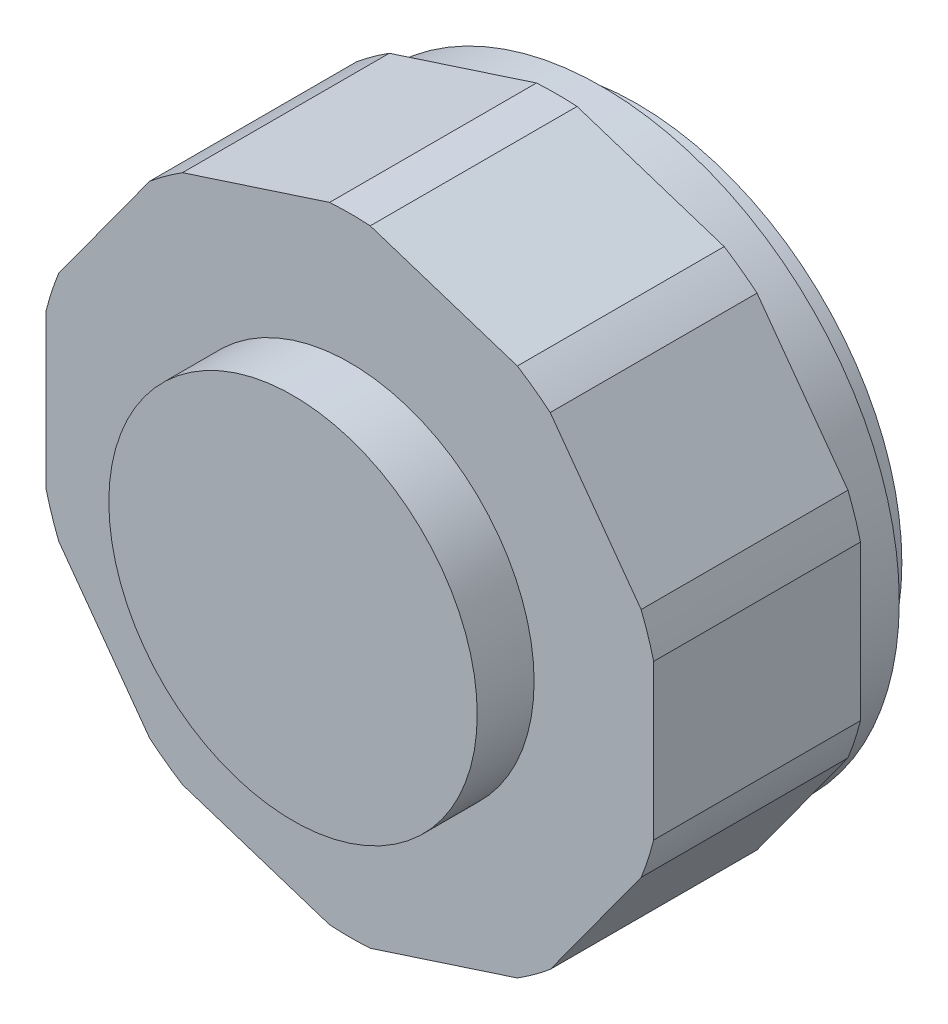
ISO-10303-21;
HEADER;
FILE_DESCRIPTION(('STEP AP214'),'2;1');
FILE_NAME('part.step','',(''),(''),'','','');
FILE_SCHEMA(('AUTOMOTIVE_DESIGN { 1 0 10303 214 1 1 1 1 }'));
ENDSEC;
DATA;
#1=APPLICATION_CONTEXT('core data for automotive mechanical design processes');
#2=APPLICATION_PROTOCOL_DEFINITION('international standard','automotive_design',2000,#1);
#3=PRODUCT_CONTEXT('',#1,'mechanical');
#4=PRODUCT('Part','Part','',(#3));
#5=PRODUCT_RELATED_PRODUCT_CATEGORY('part','',(#4));
#6=PRODUCT_DEFINITION_FORMATION('','',#4);
#7=PRODUCT_DEFINITION_CONTEXT('part definition',#1,'design');
#8=PRODUCT_DEFINITION('design','',#6,#7);
#9=PRODUCT_DEFINITION_SHAPE('','',#8);
#10=(LENGTH_UNIT() NAMED_UNIT(*) SI_UNIT(.MILLI.,.METRE.));
#11=(NAMED_UNIT(*) PLANE_ANGLE_UNIT() SI_UNIT($,.RADIAN.));
#12=(NAMED_UNIT(*) SI_UNIT($,.STERADIAN.) SOLID_ANGLE_UNIT());
#13=UNCERTAINTY_MEASURE_WITH_UNIT(LENGTH_MEASURE(1.E-05),#10,'distance_accuracy_value','');
#14=(GEOMETRIC_REPRESENTATION_CONTEXT(3) GLOBAL_UNCERTAINTY_ASSIGNED_CONTEXT((#13)) GLOBAL_UNIT_ASSIGNED_CONTEXT((#10,
#11,#12)) REPRESENTATION_CONTEXT('',''));
#15=CARTESIAN_POINT('',(0.,0.,0.));
#16=DIRECTION('',(0.,0.,1.));
#17=DIRECTION('',(1.,0.,0.));
#18=AXIS2_PLACEMENT_3D('',#15,#16,#17);
#19=CARTESIAN_POINT('',(-582.,0.,957.757083440668));
#20=DIRECTION('',(0.,0.,-1.));
#21=DIRECTION('',(0.,1.,0.));
#22=AXIS2_PLACEMENT_3D('',#19,#20,#21);
#23=CYLINDRICAL_SURFACE('',#22,205.);
#24=CARTESIAN_POINT('',(-582.,0.,247.));
#25=DIRECTION('',(0.,0.,-1.));
#26=DIRECTION('',(0.,1.,0.));
#27=AXIS2_PLACEMENT_3D('',#24,#25,#26);
#28=CIRCLE('',#27,205.);
#29=CARTESIAN_POINT('',(-582.,205.,247.));
#30=VERTEX_POINT('',#29);
#31=EDGE_CURVE('E167',#30,#30,#28,.T.);
#32=ORIENTED_EDGE('',*,*,#31,.T.);
#33=EDGE_LOOP('',(#32));
#34=FACE_BOUND('',#33,.T.);
#35=CARTESIAN_POINT('',(-582.,0.,220.));
#36=DIRECTION('',(0.,0.,1.));
#37=DIRECTION('',(0.,1.,0.));
#38=AXIS2_PLACEMENT_3D('',#35,#36,#37);
#39=CIRCLE('',#38,205.);
#40=CARTESIAN_POINT('',(-582.,205.,220.));
#41=VERTEX_POINT('',#40);
#42=EDGE_CURVE('E182',#41,#41,#39,.T.);
#43=ORIENTED_EDGE('',*,*,#42,.T.);
#44=EDGE_LOOP('',(#43));
#45=FACE_BOUND('',#44,.T.);
#46=ADVANCED_FACE('F17',(#34,#45),#23,.T.);
#47=CARTESIAN_POINT('',(-582.,0.,247.));
#48=DIRECTION('',(0.,0.,-1.));
#49=DIRECTION('',(0.,1.,0.));
#50=AXIS2_PLACEMENT_3D('',#47,#48,#49);
#51=PLANE('',#50);
#52=ORIENTED_EDGE('',*,*,#31,.F.);
#53=EDGE_LOOP('',(#52));
#54=FACE_BOUND('',#53,.T.);
#55=CARTESIAN_POINT('',(-582.,0.,247.));
#56=DIRECTION('',(0.,0.,-1.));
#57=DIRECTION('',(1.,0.,0.));
#58=AXIS2_PLACEMENT_3D('',#55,#56,#57);
#59=CIRCLE('',#58,230.);
#60=CARTESIAN_POINT('',(-352.,0.,247.));
#61=VERTEX_POINT('',#60);
#62=EDGE_CURVE('E268',#61,#61,#59,.T.);
#63=ORIENTED_EDGE('',*,*,#62,.T.);
#64=EDGE_LOOP('',(#63));
#65=FACE_BOUND('',#64,.T.);
#66=ADVANCED_FACE('F392',(#54,#65),#51,.T.);
#67=CARTESIAN_POINT('',(-582.,0.,247.));
#68=DIRECTION('',(0.,0.,1.));
#69=DIRECTION('',(0.,-1.,0.));
#70=AXIS2_PLACEMENT_3D('',#67,#68,#69);
#71=CYLINDRICAL_SURFACE('',#70,230.);
#72=CARTESIAN_POINT('',(-582.,0.,282.));
#73=DIRECTION('',(0.,0.,-1.));
#74=DIRECTION('',(0.,1.,0.));
#75=AXIS2_PLACEMENT_3D('',#72,#73,#74);
#76=CIRCLE('',#75,230.);
#77=CARTESIAN_POINT('',(-582.,230.,282.));
#78=VERTEX_POINT('',#77);
#79=EDGE_CURVE('E271',#78,#78,#76,.F.);
#80=ORIENTED_EDGE('',*,*,#79,.F.);
#81=EDGE_LOOP('',(#80));
#82=FACE_BOUND('',#81,.T.);
#83=ORIENTED_EDGE('',*,*,#62,.F.);
#84=EDGE_LOOP('',(#83));
#85=FACE_BOUND('',#84,.T.);
#86=ADVANCED_FACE('F398',(#82,#85),#71,.T.);
#87=CARTESIAN_POINT('',(-582.,0.,282.));
#88=DIRECTION('',(0.,0.,-1.));
#89=DIRECTION('',(0.,1.,0.));
#90=AXIS2_PLACEMENT_3D('',#87,#88,#89);
#91=PLANE('',#90);
#92=ORIENTED_EDGE('',*,*,#79,.T.);
#93=EDGE_LOOP('',(#92));
#94=FACE_BOUND('',#93,.T.);
#95=CARTESIAN_POINT('',(-582.,0.,282.));
#96=DIRECTION('',(0.,0.,-1.));
#97=DIRECTION('',(-0.587785252292473,-0.809016994374947,0.));
#98=AXIS2_PLACEMENT_3D('',#95,#96,#97);
#99=CIRCLE('',#98,242.5);
#100=CARTESIAN_POINT('',(-427.056160116112,-186.543980020895,282.));
#101=VERTEX_POINT('',#100);
#102=CARTESIAN_POINT('',(-452.466411923327,-205.005608606162,282.));
#103=VERTEX_POINT('',#102);
#104=EDGE_CURVE('E181',#101,#103,#99,.T.);
#105=ORIENTED_EDGE('',*,*,#104,.T.);
#106=DIRECTION('',(-0.951056516295154,-0.309016994374947,0.));
#107=VECTOR('',#106,1.);
#108=CARTESIAN_POINT('',(-452.466411923327,-205.005608606162,282.));
#109=LINE('',#108,#107);
#110=CARTESIAN_POINT('',(-566.295600720448,-241.990954052561,282.));
#111=VERTEX_POINT('',#110);
#112=EDGE_CURVE('E187',#103,#111,#109,.T.);
#113=ORIENTED_EDGE('',*,*,#112,.T.);
#114=CARTESIAN_POINT('',(-597.704399279552,-241.990954052561,282.));
#115=VERTEX_POINT('',#114);
#116=EDGE_CURVE('E189',#111,#115,#99,.T.);
#117=ORIENTED_EDGE('',*,*,#116,.T.);
#118=DIRECTION('',(-0.951056516295154,0.309016994374946,0.));
#119=VECTOR('',#118,1.);
#120=CARTESIAN_POINT('',(-597.704399279552,-241.990954052561,282.));
#121=LINE('',#120,#119);
#122=CARTESIAN_POINT('',(-711.533588076673,-205.005608606162,282.));
#123=VERTEX_POINT('',#122);
#124=EDGE_CURVE('E195',#115,#123,#121,.T.);
#125=ORIENTED_EDGE('',*,*,#124,.T.);
#126=CARTESIAN_POINT('',(-582.,0.,282.));
#127=DIRECTION('',(0.,0.,-1.));
#128=DIRECTION('',(0.587785252292473,0.809016994374947,0.));
#129=AXIS2_PLACEMENT_3D('',#126,#127,#128);
#130=CIRCLE('',#129,242.5);
#131=CARTESIAN_POINT('',(-736.943839883888,-186.543980020895,282.));
#132=VERTEX_POINT('',#131);
#133=EDGE_CURVE('E200',#123,#132,#130,.T.);
#134=ORIENTED_EDGE('',*,*,#133,.T.);
#135=DIRECTION('',(-0.587785252292474,0.809016994374947,0.));
#136=VECTOR('',#135,1.);
#137=CARTESIAN_POINT('',(-736.943839883888,-186.543980020895,282.));
#138=LINE('',#137,#136);
#139=CARTESIAN_POINT('',(-807.294147472337,-89.7150885565674,282.));
#140=VERTEX_POINT('',#139);
#141=EDGE_CURVE('E204',#132,#140,#138,.T.);
#142=ORIENTED_EDGE('',*,*,#141,.T.);
#143=CARTESIAN_POINT('',(-817.,-59.843546017929,282.));
#144=VERTEX_POINT('',#143);
#145=EDGE_CURVE('E196',#140,#144,#99,.T.);
#146=ORIENTED_EDGE('',*,*,#145,.T.);
#147=DIRECTION('',(0.,1.,0.));
#148=VECTOR('',#147,1.);
#149=CARTESIAN_POINT('',(-817.,-59.8435460179289,282.));
#150=LINE('',#149,#148);
#151=CARTESIAN_POINT('',(-817.,59.843546017929,282.));
#152=VERTEX_POINT('',#151);
#153=EDGE_CURVE('E203',#144,#152,#150,.T.);
#154=ORIENTED_EDGE('',*,*,#153,.T.);
#155=CARTESIAN_POINT('',(-807.294147472337,89.7150885565677,282.));
#156=VERTEX_POINT('',#155);
#157=EDGE_CURVE('E205',#152,#156,#99,.T.);
#158=ORIENTED_EDGE('',*,*,#157,.T.);
#159=DIRECTION('',(0.587785252292473,0.809016994374948,0.));
#160=VECTOR('',#159,1.);
#161=CARTESIAN_POINT('',(-807.294147472337,89.7150885565674,282.));
#162=LINE('',#161,#160);
#163=CARTESIAN_POINT('',(-736.943839883888,186.543980020895,282.));
#164=VERTEX_POINT('',#163);
#165=EDGE_CURVE('E213',#156,#164,#162,.T.);
#166=ORIENTED_EDGE('',*,*,#165,.T.);
#167=CARTESIAN_POINT('',(-711.533588076673,205.005608606162,282.));
#168=VERTEX_POINT('',#167);
#169=EDGE_CURVE('E214',#164,#168,#99,.T.);
#170=ORIENTED_EDGE('',*,*,#169,.T.);
#171=DIRECTION('',(0.951056516295153,0.309016994374948,0.));
#172=VECTOR('',#171,1.);
#173=CARTESIAN_POINT('',(-711.533588076673,205.005608606162,282.));
#174=LINE('',#173,#172);
#175=CARTESIAN_POINT('',(-597.704399279553,241.990954052561,282.));
#176=VERTEX_POINT('',#175);
#177=EDGE_CURVE('E220',#168,#176,#174,.T.);
#178=ORIENTED_EDGE('',*,*,#177,.T.);
#179=CARTESIAN_POINT('',(-566.295600720447,241.990954052561,282.));
#180=VERTEX_POINT('',#179);
#181=EDGE_CURVE('E221',#176,#180,#99,.T.);
#182=ORIENTED_EDGE('',*,*,#181,.T.);
#183=DIRECTION('',(0.951056516295154,-0.309016994374947,0.));
#184=VECTOR('',#183,1.);
#185=CARTESIAN_POINT('',(-566.295600720448,241.990954052561,282.));
#186=LINE('',#185,#184);
#187=CARTESIAN_POINT('',(-452.466411923327,205.005608606162,282.));
#188=VERTEX_POINT('',#187);
#189=EDGE_CURVE('E227',#180,#188,#186,.T.);
#190=ORIENTED_EDGE('',*,*,#189,.T.);
#191=CARTESIAN_POINT('',(-427.056160116112,186.543980020895,282.));
#192=VERTEX_POINT('',#191);
#193=EDGE_CURVE('E186',#188,#192,#99,.T.);
#194=ORIENTED_EDGE('',*,*,#193,.T.);
#195=DIRECTION('',(0.587785252292474,-0.809016994374947,0.));
#196=VECTOR('',#195,1.);
#197=CARTESIAN_POINT('',(-427.056160116112,186.543980020895,282.));
#198=LINE('',#197,#196);
#199=CARTESIAN_POINT('',(-356.705852527663,89.7150885565675,282.));
#200=VERTEX_POINT('',#199);
#201=EDGE_CURVE('E185',#192,#200,#198,.T.);
#202=ORIENTED_EDGE('',*,*,#201,.T.);
#203=CARTESIAN_POINT('',(-347.,59.8435460179294,282.));
#204=VERTEX_POINT('',#203);
#205=EDGE_CURVE('E176',#200,#204,#99,.T.);
#206=ORIENTED_EDGE('',*,*,#205,.T.);
#207=DIRECTION('',(0.,-1.,0.));
#208=VECTOR('',#207,1.);
#209=CARTESIAN_POINT('',(-347.,59.8435460179291,282.));
#210=LINE('',#209,#208);
#211=CARTESIAN_POINT('',(-347.,-59.843546017929,282.));
#212=VERTEX_POINT('',#211);
#213=EDGE_CURVE('E161',#204,#212,#210,.T.);
#214=ORIENTED_EDGE('',*,*,#213,.T.);
#215=CARTESIAN_POINT('',(-356.705852527663,-89.7150885565673,282.));
#216=VERTEX_POINT('',#215);
#217=EDGE_CURVE('E173',#212,#216,#99,.T.);
#218=ORIENTED_EDGE('',*,*,#217,.T.);
#219=DIRECTION('',(-0.587785252292473,-0.809016994374948,0.));
#220=VECTOR('',#219,1.);
#221=CARTESIAN_POINT('',(-356.705852527663,-89.7150885565676,282.));
#222=LINE('',#221,#220);
#223=EDGE_CURVE('E179',#216,#101,#222,.T.);
#224=ORIENTED_EDGE('',*,*,#223,.T.);
#225=EDGE_LOOP('',(#105,#113,#117,#125,#134,#142,#146,#154,#158,#166,#170,#178,#182,#190,#194,
#202,#206,#214,#218,#224));
#226=FACE_BOUND('',#225,.T.);
#227=ADVANCED_FACE('F172',(#94,#226),#91,.T.);
#228=CARTESIAN_POINT('',(-1918.04600991423,770.513838716696,220.));
#229=DIRECTION('',(0.,0.,1.));
#230=DIRECTION('',(0.,-1.,0.));
#231=AXIS2_PLACEMENT_3D('',#228,#229,#230);
#232=PLANE('',#231);
#233=ORIENTED_EDGE('',*,*,#42,.F.);
#234=EDGE_LOOP('',(#233));
#235=FACE_BOUND('',#234,.T.);
#236=ADVANCED_FACE('F410',(#235),#232,.F.);
#237=CARTESIAN_POINT('',(-582.,0.,282.));
#238=DIRECTION('',(0.,0.,1.));
#239=DIRECTION('',(0.,-1.,0.));
#240=AXIS2_PLACEMENT_3D('',#237,#238,#239);
#241=CYLINDRICAL_SURFACE('',#240,242.5);
#242=DIRECTION('',(0.,0.,1.));
#243=VECTOR('',#242,1.);
#244=CARTESIAN_POINT('',(-347.,59.843546017929,282.));
#245=LINE('',#244,#243);
#246=CARTESIAN_POINT('',(-347.,59.8435460179294,442.));
#247=VERTEX_POINT('',#246);
#248=EDGE_CURVE('E26',#247,#204,#245,.F.);
#249=ORIENTED_EDGE('',*,*,#248,.T.);
#250=ORIENTED_EDGE('',*,*,#205,.F.);
#251=DIRECTION('',(0.,0.,1.));
#252=VECTOR('',#251,1.);
#253=CARTESIAN_POINT('',(-356.705852527663,89.7150885565674,282.));
#254=LINE('',#253,#252);
#255=CARTESIAN_POINT('',(-356.705852527663,89.7150885565675,442.));
#256=VERTEX_POINT('',#255);
#257=EDGE_CURVE('E280',#256,#200,#254,.F.);
#258=ORIENTED_EDGE('',*,*,#257,.F.);
#259=CARTESIAN_POINT('',(-582.,0.,442.));
#260=DIRECTION('',(0.,0.,-1.));
#261=DIRECTION('',(-0.587785252292473,-0.809016994374947,0.));
#262=AXIS2_PLACEMENT_3D('',#259,#260,#261);
#263=CIRCLE('',#262,242.5);
#264=EDGE_CURVE('E279',#256,#247,#263,.T.);
#265=ORIENTED_EDGE('',*,*,#264,.T.);
#266=EDGE_LOOP('',(#249,#250,#258,#265));
#267=FACE_BOUND('',#266,.T.);
#268=ADVANCED_FACE('F19',(#267),#241,.T.);
#269=DIRECTION('',(0.,0.,1.));
#270=VECTOR('',#269,1.);
#271=CARTESIAN_POINT('',(-356.705852527663,-89.7150885565675,282.));
#272=LINE('',#271,#270);
#273=CARTESIAN_POINT('',(-356.705852527663,-89.7150885565673,442.));
#274=VERTEX_POINT('',#273);
#275=EDGE_CURVE('E96',#274,#216,#272,.F.);
#276=ORIENTED_EDGE('',*,*,#275,.T.);
#277=ORIENTED_EDGE('',*,*,#217,.F.);
#278=DIRECTION('',(0.,0.,1.));
#279=VECTOR('',#278,1.);
#280=CARTESIAN_POINT('',(-347.,-59.843546017929,282.));
#281=LINE('',#280,#279);
#282=CARTESIAN_POINT('',(-347.,-59.843546017929,442.));
#283=VERTEX_POINT('',#282);
#284=EDGE_CURVE('E158',#283,#212,#281,.F.);
#285=ORIENTED_EDGE('',*,*,#284,.F.);
#286=EDGE_CURVE('E192',#283,#274,#263,.T.);
#287=ORIENTED_EDGE('',*,*,#286,.T.);
#288=EDGE_LOOP('',(#276,#277,#285,#287));
#289=FACE_BOUND('',#288,.T.);
#290=ADVANCED_FACE('F178',(#289),#241,.T.);
#291=CARTESIAN_POINT('',(-347.,-54.6717477313467,1113.75708344067));
#292=DIRECTION('',(-1.,0.,0.));
#293=DIRECTION('',(0.,1.,0.));
#294=AXIS2_PLACEMENT_3D('',#291,#292,#293);
#295=PLANE('',#294);
#296=ORIENTED_EDGE('',*,*,#248,.F.);
#297=DIRECTION('',(0.,-1.,0.));
#298=VECTOR('',#297,1.);
#299=CARTESIAN_POINT('',(-347.,59.8435460179291,442.));
#300=LINE('',#299,#298);
#301=EDGE_CURVE('E163',#247,#283,#300,.T.);
#302=ORIENTED_EDGE('',*,*,#301,.T.);
#303=ORIENTED_EDGE('',*,*,#284,.T.);
#304=ORIENTED_EDGE('',*,*,#213,.F.);
#305=EDGE_LOOP('',(#296,#302,#303,#304));
#306=FACE_BOUND('',#305,.T.);
#307=ADVANCED_FACE('F160',(#306),#295,.F.);
#308=CARTESIAN_POINT('',(-561.376928259029,-240.392780490527,1108.84168369942));
#309=DIRECTION('',(-0.309016994374948,0.951056516295154,0.));
#310=DIRECTION('',(0.951056516295154,0.309016994374948,0.));
#311=AXIS2_PLACEMENT_3D('',#308,#309,#310);
#312=PLANE('',#311);
#313=DIRECTION('',(0.,0.,1.));
#314=VECTOR('',#313,1.);
#315=CARTESIAN_POINT('',(-452.466411923327,-205.005608606162,282.));
#316=LINE('',#315,#314);
#317=CARTESIAN_POINT('',(-452.466411923327,-205.005608606162,442.));
#318=VERTEX_POINT('',#317);
#319=EDGE_CURVE('E105',#318,#103,#316,.F.);
#320=ORIENTED_EDGE('',*,*,#319,.F.);
#321=DIRECTION('',(-0.951056516295154,-0.309016994374947,0.));
#322=VECTOR('',#321,1.);
#323=CARTESIAN_POINT('',(-452.466411923327,-205.005608606162,442.));
#324=LINE('',#323,#322);
#325=CARTESIAN_POINT('',(-566.295600720448,-241.990954052561,442.));
#326=VERTEX_POINT('',#325);
#327=EDGE_CURVE('E296',#318,#326,#324,.T.);
#328=ORIENTED_EDGE('',*,*,#327,.T.);
#329=DIRECTION('',(0.,0.,1.));
#330=VECTOR('',#329,1.);
#331=CARTESIAN_POINT('',(-566.295600720448,-241.990954052561,282.));
#332=LINE('',#331,#330);
#333=EDGE_CURVE('E263',#326,#111,#332,.F.);
#334=ORIENTED_EDGE('',*,*,#333,.T.);
#335=ORIENTED_EDGE('',*,*,#112,.F.);
#336=EDGE_LOOP('',(#320,#328,#334,#335));
#337=FACE_BOUND('',#336,.T.);
#338=ADVANCED_FACE('F380',(#337),#312,.F.);
#339=DIRECTION('',(0.,0.,1.));
#340=VECTOR('',#339,1.);
#341=CARTESIAN_POINT('',(-597.704399279552,-241.990954052561,282.));
#342=LINE('',#341,#340);
#343=CARTESIAN_POINT('',(-597.704399279552,-241.990954052561,442.));
#344=VERTEX_POINT('',#343);
#345=EDGE_CURVE('E261',#344,#115,#342,.F.);
#346=ORIENTED_EDGE('',*,*,#345,.T.);
#347=ORIENTED_EDGE('',*,*,#116,.F.);
#348=ORIENTED_EDGE('',*,*,#333,.F.);
#349=EDGE_CURVE('E297',#326,#344,#263,.T.);
#350=ORIENTED_EDGE('',*,*,#349,.T.);
#351=EDGE_LOOP('',(#346,#347,#348,#350));
#352=FACE_BOUND('',#351,.T.);
#353=ADVANCED_FACE('F379',(#352),#241,.T.);
#354=ORIENTED_EDGE('',*,*,#319,.T.);
#355=ORIENTED_EDGE('',*,*,#104,.F.);
#356=DIRECTION('',(0.,0.,1.));
#357=VECTOR('',#356,1.);
#358=CARTESIAN_POINT('',(-427.056160116112,-186.543980020895,282.));
#359=LINE('',#358,#357);
#360=CARTESIAN_POINT('',(-427.056160116112,-186.543980020895,442.));
#361=VERTEX_POINT('',#360);
#362=EDGE_CURVE('E34',#361,#101,#359,.F.);
#363=ORIENTED_EDGE('',*,*,#362,.F.);
#364=EDGE_CURVE('E292',#361,#318,#263,.T.);
#365=ORIENTED_EDGE('',*,*,#364,.T.);
#366=EDGE_LOOP('',(#354,#355,#363,#365));
#367=FACE_BOUND('',#366,.T.);
#368=ADVANCED_FACE('F381',(#367),#241,.T.);
#369=CARTESIAN_POINT('',(-424.016253355428,-182.35990731557,1108.84168369942));
#370=DIRECTION('',(-0.809016994374947,0.587785252292473,0.));
#371=DIRECTION('',(0.587785252292473,0.809016994374948,0.));
#372=AXIS2_PLACEMENT_3D('',#369,#370,#371);
#373=PLANE('',#372);
#374=ORIENTED_EDGE('',*,*,#362,.T.);
#375=ORIENTED_EDGE('',*,*,#223,.F.);
#376=ORIENTED_EDGE('',*,*,#275,.F.);
#377=DIRECTION('',(-0.587785252292473,-0.809016994374948,0.));
#378=VECTOR('',#377,1.);
#379=CARTESIAN_POINT('',(-356.705852527663,-89.7150885565676,442.));
#380=LINE('',#379,#378);
#381=EDGE_CURVE('E188',#274,#361,#380,.T.);
#382=ORIENTED_EDGE('',*,*,#381,.T.);
#383=EDGE_LOOP('',(#374,#375,#376,#382));
#384=FACE_BOUND('',#383,.T.);
#385=ADVANCED_FACE('F383',(#384),#373,.F.);
#386=CARTESIAN_POINT('',(-804.254240711652,-93.8991612618916,1108.84168369942));
#387=DIRECTION('',(0.809016994374947,0.587785252292473,0.));
#388=DIRECTION('',(0.587785252292473,-0.809016994374947,0.));
#389=AXIS2_PLACEMENT_3D('',#386,#387,#388);
#390=PLANE('',#389);
#391=DIRECTION('',(0.,0.,1.));
#392=VECTOR('',#391,1.);
#393=CARTESIAN_POINT('',(-736.943839883888,-186.543980020895,282.));
#394=LINE('',#393,#392);
#395=CARTESIAN_POINT('',(-736.943839883888,-186.543980020895,442.));
#396=VERTEX_POINT('',#395);
#397=EDGE_CURVE('E244',#396,#132,#394,.F.);
#398=ORIENTED_EDGE('',*,*,#397,.F.);
#399=DIRECTION('',(-0.587785252292474,0.809016994374947,0.));
#400=VECTOR('',#399,1.);
#401=CARTESIAN_POINT('',(-736.943839883888,-186.543980020895,442.));
#402=LINE('',#401,#400);
#403=CARTESIAN_POINT('',(-807.294147472337,-89.7150885565674,442.));
#404=VERTEX_POINT('',#403);
#405=EDGE_CURVE('E248',#396,#404,#402,.T.);
#406=ORIENTED_EDGE('',*,*,#405,.T.);
#407=DIRECTION('',(0.,0.,1.));
#408=VECTOR('',#407,1.);
#409=CARTESIAN_POINT('',(-807.294147472337,-89.7150885565674,282.));
#410=LINE('',#409,#408);
#411=EDGE_CURVE('E246',#404,#140,#410,.F.);
#412=ORIENTED_EDGE('',*,*,#411,.T.);
#413=ORIENTED_EDGE('',*,*,#141,.F.);
#414=EDGE_LOOP('',(#398,#406,#412,#413));
#415=FACE_BOUND('',#414,.T.);
#416=ADVANCED_FACE('F242',(#415),#390,.F.);
#417=DIRECTION('',(0.,0.,1.));
#418=VECTOR('',#417,1.);
#419=CARTESIAN_POINT('',(-817.,-59.8435460179289,282.));
#420=LINE('',#419,#418);
#421=CARTESIAN_POINT('',(-817.,-59.843546017929,442.));
#422=VERTEX_POINT('',#421);
#423=EDGE_CURVE('E252',#422,#144,#420,.F.);
#424=ORIENTED_EDGE('',*,*,#423,.T.);
#425=ORIENTED_EDGE('',*,*,#145,.F.);
#426=ORIENTED_EDGE('',*,*,#411,.F.);
#427=EDGE_CURVE('E360',#404,#422,#263,.T.);
#428=ORIENTED_EDGE('',*,*,#427,.T.);
#429=EDGE_LOOP('',(#424,#425,#426,#428));
#430=FACE_BOUND('',#429,.T.);
#431=ADVANCED_FACE('F445',(#430),#241,.T.);
#432=ORIENTED_EDGE('',*,*,#397,.T.);
#433=ORIENTED_EDGE('',*,*,#133,.F.);
#434=DIRECTION('',(0.,0.,1.));
#435=VECTOR('',#434,1.);
#436=CARTESIAN_POINT('',(-711.533588076673,-205.005608606162,282.));
#437=LINE('',#436,#435);
#438=CARTESIAN_POINT('',(-711.533588076673,-205.005608606162,442.));
#439=VERTEX_POINT('',#438);
#440=EDGE_CURVE('E254',#439,#123,#437,.F.);
#441=ORIENTED_EDGE('',*,*,#440,.F.);
#442=CARTESIAN_POINT('',(-582.,0.,442.));
#443=DIRECTION('',(0.,0.,-1.));
#444=DIRECTION('',(0.587785252292473,0.809016994374947,0.));
#445=AXIS2_PLACEMENT_3D('',#442,#443,#444);
#446=CIRCLE('',#445,242.5);
#447=EDGE_CURVE('E362',#439,#396,#446,.T.);
#448=ORIENTED_EDGE('',*,*,#447,.T.);
#449=EDGE_LOOP('',(#432,#433,#441,#448));
#450=FACE_BOUND('',#449,.T.);
#451=ADVANCED_FACE('F376',(#450),#241,.T.);
#452=CARTESIAN_POINT('',(-706.614915615255,-206.603782168195,1108.84168369942));
#453=DIRECTION('',(0.309016994374948,0.951056516295153,0.));
#454=DIRECTION('',(0.951056516295154,-0.309016994374948,0.));
#455=AXIS2_PLACEMENT_3D('',#452,#453,#454);
#456=PLANE('',#455);
#457=ORIENTED_EDGE('',*,*,#440,.T.);
#458=ORIENTED_EDGE('',*,*,#124,.F.);
#459=ORIENTED_EDGE('',*,*,#345,.F.);
#460=DIRECTION('',(-0.951056516295154,0.309016994374946,0.));
#461=VECTOR('',#460,1.);
#462=CARTESIAN_POINT('',(-597.704399279552,-241.990954052561,442.));
#463=LINE('',#462,#461);
#464=EDGE_CURVE('E365',#344,#439,#463,.T.);
#465=ORIENTED_EDGE('',*,*,#464,.T.);
#466=EDGE_LOOP('',(#457,#458,#459,#465));
#467=FACE_BOUND('',#466,.T.);
#468=ADVANCED_FACE('F378',(#467),#456,.F.);
#469=CARTESIAN_POINT('',(-739.983746644572,182.35990731557,1103.97042580837));
#470=DIRECTION('',(0.809016994374948,-0.587785252292473,0.));
#471=DIRECTION('',(-0.587785252292473,-0.809016994374948,0.));
#472=AXIS2_PLACEMENT_3D('',#469,#470,#471);
#473=PLANE('',#472);
#474=DIRECTION('',(0.,0.,1.));
#475=VECTOR('',#474,1.);
#476=CARTESIAN_POINT('',(-807.294147472337,89.7150885565672,282.));
#477=LINE('',#476,#475);
#478=CARTESIAN_POINT('',(-807.294147472337,89.7150885565677,442.));
#479=VERTEX_POINT('',#478);
#480=EDGE_CURVE('E316',#479,#156,#477,.F.);
#481=ORIENTED_EDGE('',*,*,#480,.F.);
#482=DIRECTION('',(0.587785252292473,0.809016994374948,0.));
#483=VECTOR('',#482,1.);
#484=CARTESIAN_POINT('',(-807.294147472337,89.7150885565674,442.));
#485=LINE('',#484,#483);
#486=CARTESIAN_POINT('',(-736.943839883888,186.543980020895,442.));
#487=VERTEX_POINT('',#486);
#488=EDGE_CURVE('E331',#479,#487,#485,.T.);
#489=ORIENTED_EDGE('',*,*,#488,.T.);
#490=DIRECTION('',(0.,0.,1.));
#491=VECTOR('',#490,1.);
#492=CARTESIAN_POINT('',(-736.943839883888,186.543980020895,282.));
#493=LINE('',#492,#491);
#494=EDGE_CURVE('E314',#487,#164,#493,.F.);
#495=ORIENTED_EDGE('',*,*,#494,.T.);
#496=ORIENTED_EDGE('',*,*,#165,.F.);
#497=EDGE_LOOP('',(#481,#489,#495,#496));
#498=FACE_BOUND('',#497,.T.);
#499=ADVANCED_FACE('F330',(#498),#473,.F.);
#500=DIRECTION('',(0.,0.,1.));
#501=VECTOR('',#500,1.);
#502=CARTESIAN_POINT('',(-711.533588076673,205.005608606162,282.));
#503=LINE('',#502,#501);
#504=CARTESIAN_POINT('',(-711.533588076673,205.005608606162,442.));
#505=VERTEX_POINT('',#504);
#506=EDGE_CURVE('E312',#505,#168,#503,.F.);
#507=ORIENTED_EDGE('',*,*,#506,.T.);
#508=ORIENTED_EDGE('',*,*,#169,.F.);
#509=ORIENTED_EDGE('',*,*,#494,.F.);
#510=EDGE_CURVE('E336',#487,#505,#263,.T.);
#511=ORIENTED_EDGE('',*,*,#510,.T.);
#512=EDGE_LOOP('',(#507,#508,#509,#511));
#513=FACE_BOUND('',#512,.T.);
#514=ADVANCED_FACE('F334',(#513),#241,.T.);
#515=ORIENTED_EDGE('',*,*,#480,.T.);
#516=ORIENTED_EDGE('',*,*,#157,.F.);
#517=DIRECTION('',(0.,0.,1.));
#518=VECTOR('',#517,1.);
#519=CARTESIAN_POINT('',(-817.,59.843546017929,282.));
#520=LINE('',#519,#518);
#521=CARTESIAN_POINT('',(-817.,59.843546017929,442.));
#522=VERTEX_POINT('',#521);
#523=EDGE_CURVE('E256',#522,#152,#520,.F.);
#524=ORIENTED_EDGE('',*,*,#523,.F.);
#525=EDGE_CURVE('E326',#522,#479,#263,.T.);
#526=ORIENTED_EDGE('',*,*,#525,.T.);
#527=EDGE_LOOP('',(#515,#516,#524,#526));
#528=FACE_BOUND('',#527,.T.);
#529=ADVANCED_FACE('F325',(#528),#241,.T.);
#530=CARTESIAN_POINT('',(-817.,54.6717477313468,1108.84168369942));
#531=DIRECTION('',(1.,0.,0.));
#532=DIRECTION('',(0.,-1.,0.));
#533=AXIS2_PLACEMENT_3D('',#530,#531,#532);
#534=PLANE('',#533);
#535=ORIENTED_EDGE('',*,*,#523,.T.);
#536=ORIENTED_EDGE('',*,*,#153,.F.);
#537=ORIENTED_EDGE('',*,*,#423,.F.);
#538=DIRECTION('',(0.,1.,0.));
#539=VECTOR('',#538,1.);
#540=CARTESIAN_POINT('',(-817.,-59.8435460179289,442.));
#541=LINE('',#540,#539);
#542=EDGE_CURVE('E321',#422,#522,#541,.T.);
#543=ORIENTED_EDGE('',*,*,#542,.T.);
#544=EDGE_LOOP('',(#535,#536,#537,#543));
#545=FACE_BOUND('',#544,.T.);
#546=ADVANCED_FACE('F319',(#545),#534,.F.);
#547=CARTESIAN_POINT('',(-457.385084384745,206.603782168195,1103.97042580837));
#548=DIRECTION('',(-0.309016994374948,-0.951056516295154,0.));
#549=DIRECTION('',(-0.951056516295154,0.309016994374948,0.));
#550=AXIS2_PLACEMENT_3D('',#547,#548,#549);
#551=PLANE('',#550);
#552=DIRECTION('',(0.,0.,1.));
#553=VECTOR('',#552,1.);
#554=CARTESIAN_POINT('',(-566.295600720448,241.990954052561,282.));
#555=LINE('',#554,#553);
#556=CARTESIAN_POINT('',(-566.295600720447,241.990954052561,442.));
#557=VERTEX_POINT('',#556);
#558=EDGE_CURVE('E308',#557,#180,#555,.F.);
#559=ORIENTED_EDGE('',*,*,#558,.F.);
#560=DIRECTION('',(0.951056516295154,-0.309016994374947,0.));
#561=VECTOR('',#560,1.);
#562=CARTESIAN_POINT('',(-566.295600720448,241.990954052561,442.));
#563=LINE('',#562,#561);
#564=CARTESIAN_POINT('',(-452.466411923327,205.005608606162,442.));
#565=VERTEX_POINT('',#564);
#566=EDGE_CURVE('E351',#557,#565,#563,.T.);
#567=ORIENTED_EDGE('',*,*,#566,.T.);
#568=DIRECTION('',(0.,0.,1.));
#569=VECTOR('',#568,1.);
#570=CARTESIAN_POINT('',(-452.466411923327,205.005608606162,282.));
#571=LINE('',#570,#569);
#572=EDGE_CURVE('E306',#565,#188,#571,.F.);
#573=ORIENTED_EDGE('',*,*,#572,.T.);
#574=ORIENTED_EDGE('',*,*,#189,.F.);
#575=EDGE_LOOP('',(#559,#567,#573,#574));
#576=FACE_BOUND('',#575,.T.);
#577=ADVANCED_FACE('F350',(#576),#551,.F.);
#578=DIRECTION('',(0.,0.,1.));
#579=VECTOR('',#578,1.);
#580=CARTESIAN_POINT('',(-427.056160116112,186.543980020895,282.));
#581=LINE('',#580,#579);
#582=CARTESIAN_POINT('',(-427.056160116112,186.543980020895,442.));
#583=VERTEX_POINT('',#582);
#584=EDGE_CURVE('E304',#583,#192,#581,.F.);
#585=ORIENTED_EDGE('',*,*,#584,.T.);
#586=ORIENTED_EDGE('',*,*,#193,.F.);
#587=ORIENTED_EDGE('',*,*,#572,.F.);
#588=EDGE_CURVE('E286',#565,#583,#263,.T.);
#589=ORIENTED_EDGE('',*,*,#588,.T.);
#590=EDGE_LOOP('',(#585,#586,#587,#589));
#591=FACE_BOUND('',#590,.T.);
#592=ADVANCED_FACE('F354',(#591),#241,.T.);
#593=ORIENTED_EDGE('',*,*,#558,.T.);
#594=ORIENTED_EDGE('',*,*,#181,.F.);
#595=DIRECTION('',(0.,0.,1.));
#596=VECTOR('',#595,1.);
#597=CARTESIAN_POINT('',(-597.704399279552,241.990954052561,282.));
#598=LINE('',#597,#596);
#599=CARTESIAN_POINT('',(-597.704399279553,241.990954052561,442.));
#600=VERTEX_POINT('',#599);
#601=EDGE_CURVE('E310',#600,#176,#598,.F.);
#602=ORIENTED_EDGE('',*,*,#601,.F.);
#603=EDGE_CURVE('E346',#600,#557,#263,.T.);
#604=ORIENTED_EDGE('',*,*,#603,.T.);
#605=EDGE_LOOP('',(#593,#594,#602,#604));
#606=FACE_BOUND('',#605,.T.);
#607=ADVANCED_FACE('F344',(#606),#241,.T.);
#608=CARTESIAN_POINT('',(-602.623071740971,240.392780490527,1103.97042580837));
#609=DIRECTION('',(0.309016994374948,-0.951056516295154,0.));
#610=DIRECTION('',(-0.951056516295154,-0.309016994374948,0.));
#611=AXIS2_PLACEMENT_3D('',#608,#609,#610);
#612=PLANE('',#611);
#613=ORIENTED_EDGE('',*,*,#601,.T.);
#614=ORIENTED_EDGE('',*,*,#177,.F.);
#615=ORIENTED_EDGE('',*,*,#506,.F.);
#616=DIRECTION('',(0.951056516295153,0.309016994374948,0.));
#617=VECTOR('',#616,1.);
#618=CARTESIAN_POINT('',(-711.533588076673,205.005608606162,442.));
#619=LINE('',#618,#617);
#620=EDGE_CURVE('E341',#505,#600,#619,.T.);
#621=ORIENTED_EDGE('',*,*,#620,.T.);
#622=EDGE_LOOP('',(#613,#614,#615,#621));
#623=FACE_BOUND('',#622,.T.);
#624=ADVANCED_FACE('F340',(#623),#612,.F.);
#625=CARTESIAN_POINT('',(-359.745759288348,93.8991612618918,1103.97042580837));
#626=DIRECTION('',(-0.809016994374947,-0.587785252292473,0.));
#627=DIRECTION('',(-0.587785252292473,0.809016994374947,0.));
#628=AXIS2_PLACEMENT_3D('',#625,#626,#627);
#629=PLANE('',#628);
#630=ORIENTED_EDGE('',*,*,#257,.T.);
#631=ORIENTED_EDGE('',*,*,#201,.F.);
#632=ORIENTED_EDGE('',*,*,#584,.F.);
#633=DIRECTION('',(0.587785252292474,-0.809016994374947,0.));
#634=VECTOR('',#633,1.);
#635=CARTESIAN_POINT('',(-427.056160116112,186.543980020895,442.));
#636=LINE('',#635,#634);
#637=EDGE_CURVE('E284',#583,#256,#636,.T.);
#638=ORIENTED_EDGE('',*,*,#637,.T.);
#639=EDGE_LOOP('',(#630,#631,#632,#638));
#640=FACE_BOUND('',#639,.T.);
#641=ADVANCED_FACE('F357',(#640),#629,.F.);
#642=CARTESIAN_POINT('',(-582.,0.,486.));
#643=DIRECTION('',(0.,0.,1.));
#644=DIRECTION('',(0.,-1.,0.));
#645=AXIS2_PLACEMENT_3D('',#642,#643,#644);
#646=PLANE('',#645);
#647=CARTESIAN_POINT('',(-582.,0.,486.));
#648=DIRECTION('',(0.,0.,1.));
#649=DIRECTION('',(1.,0.,0.));
#650=AXIS2_PLACEMENT_3D('',#647,#648,#649);
#651=CIRCLE('',#650,142.5);
#652=CARTESIAN_POINT('',(-439.5,0.,486.));
#653=VERTEX_POINT('',#652);
#654=EDGE_CURVE('E300',#653,#653,#651,.T.);
#655=ORIENTED_EDGE('',*,*,#654,.T.);
#656=EDGE_LOOP('',(#655));
#657=FACE_BOUND('',#656,.T.);
#658=ADVANCED_FACE('F426',(#657),#646,.T.);
#659=CARTESIAN_POINT('',(-582.,0.,486.));
#660=DIRECTION('',(0.,0.,-1.));
#661=DIRECTION('',(0.,1.,0.));
#662=AXIS2_PLACEMENT_3D('',#659,#660,#661);
#663=CYLINDRICAL_SURFACE('',#662,142.5);
#664=ORIENTED_EDGE('',*,*,#654,.F.);
#665=EDGE_LOOP('',(#664));
#666=FACE_BOUND('',#665,.T.);
#667=CARTESIAN_POINT('',(-582.,0.,442.));
#668=DIRECTION('',(0.,0.,-1.));
#669=DIRECTION('',(1.,0.,0.));
#670=AXIS2_PLACEMENT_3D('',#667,#668,#669);
#671=CIRCLE('',#670,142.5);
#672=CARTESIAN_POINT('',(-439.5,0.,442.));
#673=VERTEX_POINT('',#672);
#674=EDGE_CURVE('E11',#673,#673,#671,.T.);
#675=ORIENTED_EDGE('',*,*,#674,.F.);
#676=EDGE_LOOP('',(#675));
#677=FACE_BOUND('',#676,.T.);
#678=ADVANCED_FACE('F408',(#666,#677),#663,.T.);
#679=CARTESIAN_POINT('',(-582.,0.,442.));
#680=DIRECTION('',(0.,0.,-1.));
#681=DIRECTION('',(0.,1.,0.));
#682=AXIS2_PLACEMENT_3D('',#679,#680,#681);
#683=PLANE('',#682);
#684=ORIENTED_EDGE('',*,*,#364,.F.);
#685=ORIENTED_EDGE('',*,*,#381,.F.);
#686=ORIENTED_EDGE('',*,*,#286,.F.);
#687=ORIENTED_EDGE('',*,*,#301,.F.);
#688=ORIENTED_EDGE('',*,*,#264,.F.);
#689=ORIENTED_EDGE('',*,*,#637,.F.);
#690=ORIENTED_EDGE('',*,*,#588,.F.);
#691=ORIENTED_EDGE('',*,*,#566,.F.);
#692=ORIENTED_EDGE('',*,*,#603,.F.);
#693=ORIENTED_EDGE('',*,*,#620,.F.);
#694=ORIENTED_EDGE('',*,*,#510,.F.);
#695=ORIENTED_EDGE('',*,*,#488,.F.);
#696=ORIENTED_EDGE('',*,*,#525,.F.);
#697=ORIENTED_EDGE('',*,*,#542,.F.);
#698=ORIENTED_EDGE('',*,*,#427,.F.);
#699=ORIENTED_EDGE('',*,*,#405,.F.);
#700=ORIENTED_EDGE('',*,*,#447,.F.);
#701=ORIENTED_EDGE('',*,*,#464,.F.);
#702=ORIENTED_EDGE('',*,*,#349,.F.);
#703=ORIENTED_EDGE('',*,*,#327,.F.);
#704=EDGE_LOOP('',(#684,#685,#686,#687,#688,#689,#690,#691,#692,#693,#694,#695,#696,#697,#698,
#699,#700,#701,#702,#703));
#705=FACE_BOUND('',#704,.T.);
#706=ORIENTED_EDGE('',*,*,#674,.T.);
#707=EDGE_LOOP('',(#706));
#708=FACE_BOUND('',#707,.T.);
#709=ADVANCED_FACE('F288',(#705,#708),#683,.F.);
#710=CLOSED_SHELL('',(#46,#66,#86,#227,#236,#268,#290,#307,#338,#353,#368,#385,#416,#431,#451,
#468,#499,#514,#529,#546,#577,#592,#607,#624,#641,#658,#678,#709));
#711=MANIFOLD_SOLID_BREP('B1',#710);
#712=ADVANCED_BREP_SHAPE_REPRESENTATION('',(#18,#711),#14);
#713=SHAPE_DEFINITION_REPRESENTATION(#9,#712);
ENDSEC;
END-ISO-10303-21;
